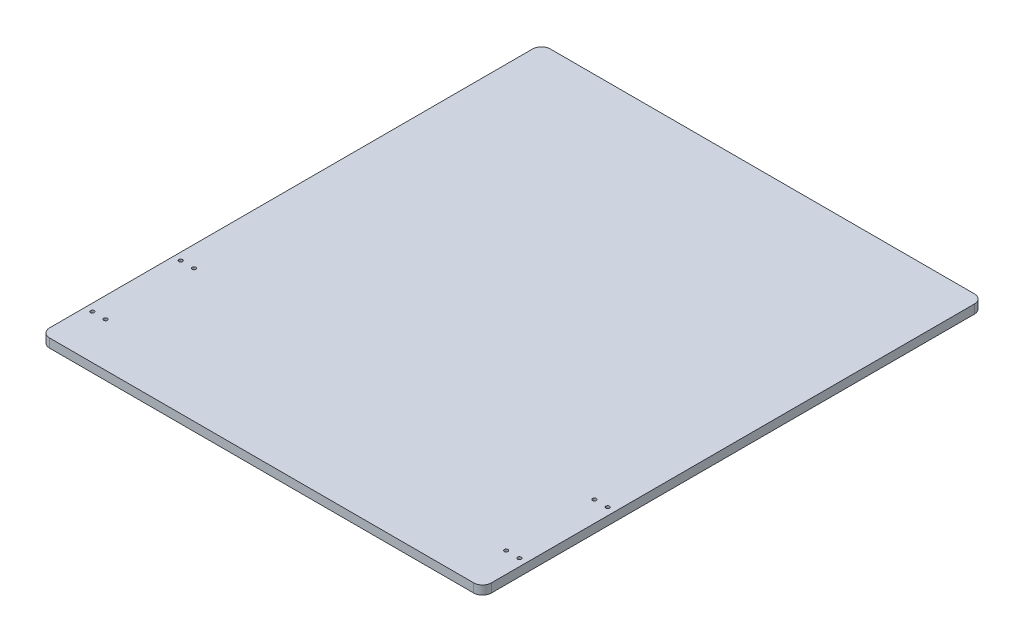
ISO-10303-21;
HEADER;
FILE_DESCRIPTION(('STEP AP214'),'2;1');
FILE_NAME('part.step','',(''),(''),'','','');
FILE_SCHEMA(('AUTOMOTIVE_DESIGN { 1 0 10303 214 1 1 1 1 }'));
ENDSEC;
DATA;
#1=APPLICATION_CONTEXT('core data for automotive mechanical design processes');
#2=APPLICATION_PROTOCOL_DEFINITION('international standard','automotive_design',2000,#1);
#3=PRODUCT_CONTEXT('',#1,'mechanical');
#4=PRODUCT('Part','Part','',(#3));
#5=PRODUCT_RELATED_PRODUCT_CATEGORY('part','',(#4));
#6=PRODUCT_DEFINITION_FORMATION('','',#4);
#7=PRODUCT_DEFINITION_CONTEXT('part definition',#1,'design');
#8=PRODUCT_DEFINITION('design','',#6,#7);
#9=PRODUCT_DEFINITION_SHAPE('','',#8);
#10=(LENGTH_UNIT() NAMED_UNIT(*) SI_UNIT(.MILLI.,.METRE.));
#11=(NAMED_UNIT(*) PLANE_ANGLE_UNIT() SI_UNIT($,.RADIAN.));
#12=(NAMED_UNIT(*) SI_UNIT($,.STERADIAN.) SOLID_ANGLE_UNIT());
#13=UNCERTAINTY_MEASURE_WITH_UNIT(LENGTH_MEASURE(1.E-05),#10,'distance_accuracy_value','');
#14=(GEOMETRIC_REPRESENTATION_CONTEXT(3) GLOBAL_UNCERTAINTY_ASSIGNED_CONTEXT((#13)) GLOBAL_UNIT_ASSIGNED_CONTEXT((#10,
#11,#12)) REPRESENTATION_CONTEXT('',''));
#15=CARTESIAN_POINT('',(0.,0.,0.));
#16=DIRECTION('',(0.,0.,1.));
#17=DIRECTION('',(1.,0.,0.));
#18=AXIS2_PLACEMENT_3D('',#15,#16,#17);
#19=CARTESIAN_POINT('',(150.,6.,-170.));
#20=DIRECTION('',(-1.,0.,0.));
#21=DIRECTION('',(0.,0.,1.));
#22=AXIS2_PLACEMENT_3D('',#19,#20,#21);
#23=PLANE('',#22);
#24=DIRECTION('',(0.,0.,-1.));
#25=VECTOR('',#24,1.);
#26=CARTESIAN_POINT('',(150.,6.,-170.));
#27=LINE('',#26,#25);
#28=CARTESIAN_POINT('',(150.,6.,164.));
#29=VERTEX_POINT('',#28);
#30=CARTESIAN_POINT('',(150.,6.,-164.));
#31=VERTEX_POINT('',#30);
#32=EDGE_CURVE('E123',#29,#31,#27,.T.);
#33=ORIENTED_EDGE('',*,*,#32,.F.);
#34=DIRECTION('',(0.,-1.,0.));
#35=VECTOR('',#34,1.);
#36=CARTESIAN_POINT('',(150.,6.,164.));
#37=LINE('',#36,#35);
#38=CARTESIAN_POINT('',(150.,0.,164.));
#39=VERTEX_POINT('',#38);
#40=EDGE_CURVE('E149',#29,#39,#37,.T.);
#41=ORIENTED_EDGE('',*,*,#40,.T.);
#42=DIRECTION('',(0.,0.,-1.));
#43=VECTOR('',#42,1.);
#44=CARTESIAN_POINT('',(150.,0.,-170.));
#45=LINE('',#44,#43);
#46=CARTESIAN_POINT('',(150.,0.,-164.));
#47=VERTEX_POINT('',#46);
#48=EDGE_CURVE('E157',#39,#47,#45,.T.);
#49=ORIENTED_EDGE('',*,*,#48,.T.);
#50=DIRECTION('',(0.,-1.,0.));
#51=VECTOR('',#50,1.);
#52=CARTESIAN_POINT('',(150.,6.,-164.));
#53=LINE('',#52,#51);
#54=EDGE_CURVE('E147',#47,#31,#53,.F.);
#55=ORIENTED_EDGE('',*,*,#54,.T.);
#56=EDGE_LOOP('',(#33,#41,#49,#55));
#57=FACE_BOUND('',#56,.T.);
#58=ADVANCED_FACE('F32',(#57),#23,.F.);
#59=CARTESIAN_POINT('',(-150.,6.,-170.));
#60=DIRECTION('',(0.,0.,1.));
#61=DIRECTION('',(1.,0.,0.));
#62=AXIS2_PLACEMENT_3D('',#59,#60,#61);
#63=PLANE('',#62);
#64=DIRECTION('',(-1.,0.,0.));
#65=VECTOR('',#64,1.);
#66=CARTESIAN_POINT('',(-150.,0.,-170.));
#67=LINE('',#66,#65);
#68=CARTESIAN_POINT('',(144.,0.,-170.));
#69=VERTEX_POINT('',#68);
#70=CARTESIAN_POINT('',(-144.,0.,-170.));
#71=VERTEX_POINT('',#70);
#72=EDGE_CURVE('E128',#69,#71,#67,.T.);
#73=ORIENTED_EDGE('',*,*,#72,.T.);
#74=DIRECTION('',(0.,-1.,0.));
#75=VECTOR('',#74,1.);
#76=CARTESIAN_POINT('',(-144.,6.,-170.));
#77=LINE('',#76,#75);
#78=CARTESIAN_POINT('',(-144.,6.,-170.));
#79=VERTEX_POINT('',#78);
#80=EDGE_CURVE('E11',#71,#79,#77,.F.);
#81=ORIENTED_EDGE('',*,*,#80,.T.);
#82=DIRECTION('',(-1.,0.,0.));
#83=VECTOR('',#82,1.);
#84=CARTESIAN_POINT('',(-150.,6.,-170.));
#85=LINE('',#84,#83);
#86=CARTESIAN_POINT('',(144.,6.,-170.));
#87=VERTEX_POINT('',#86);
#88=EDGE_CURVE('E126',#87,#79,#85,.T.);
#89=ORIENTED_EDGE('',*,*,#88,.F.);
#90=DIRECTION('',(0.,-1.,0.));
#91=VECTOR('',#90,1.);
#92=CARTESIAN_POINT('',(144.,6.,-170.));
#93=LINE('',#92,#91);
#94=EDGE_CURVE('E40',#87,#69,#93,.T.);
#95=ORIENTED_EDGE('',*,*,#94,.T.);
#96=EDGE_LOOP('',(#73,#81,#89,#95));
#97=FACE_BOUND('',#96,.T.);
#98=ADVANCED_FACE('F154',(#97),#63,.F.);
#99=CARTESIAN_POINT('',(-150.,6.,-170.));
#100=DIRECTION('',(1.,0.,0.));
#101=DIRECTION('',(0.,0.,-1.));
#102=AXIS2_PLACEMENT_3D('',#99,#100,#101);
#103=PLANE('',#102);
#104=DIRECTION('',(0.,0.,1.));
#105=VECTOR('',#104,1.);
#106=CARTESIAN_POINT('',(-150.,0.,-170.));
#107=LINE('',#106,#105);
#108=CARTESIAN_POINT('',(-150.,0.,-164.));
#109=VERTEX_POINT('',#108);
#110=CARTESIAN_POINT('',(-150.,0.,164.));
#111=VERTEX_POINT('',#110);
#112=EDGE_CURVE('E124',#109,#111,#107,.T.);
#113=ORIENTED_EDGE('',*,*,#112,.T.);
#114=DIRECTION('',(0.,-1.,0.));
#115=VECTOR('',#114,1.);
#116=CARTESIAN_POINT('',(-150.,6.,164.));
#117=LINE('',#116,#115);
#118=CARTESIAN_POINT('',(-150.,6.,164.));
#119=VERTEX_POINT('',#118);
#120=EDGE_CURVE('E102',#111,#119,#117,.F.);
#121=ORIENTED_EDGE('',*,*,#120,.T.);
#122=DIRECTION('',(0.,0.,1.));
#123=VECTOR('',#122,1.);
#124=CARTESIAN_POINT('',(-150.,6.,-170.));
#125=LINE('',#124,#123);
#126=CARTESIAN_POINT('',(-150.,6.,-164.));
#127=VERTEX_POINT('',#126);
#128=EDGE_CURVE('E162',#127,#119,#125,.T.);
#129=ORIENTED_EDGE('',*,*,#128,.F.);
#130=DIRECTION('',(0.,-1.,0.));
#131=VECTOR('',#130,1.);
#132=CARTESIAN_POINT('',(-150.,6.,-164.));
#133=LINE('',#132,#131);
#134=EDGE_CURVE('E107',#127,#109,#133,.T.);
#135=ORIENTED_EDGE('',*,*,#134,.T.);
#136=EDGE_LOOP('',(#113,#121,#129,#135));
#137=FACE_BOUND('',#136,.T.);
#138=ADVANCED_FACE('F244',(#137),#103,.F.);
#139=CARTESIAN_POINT('',(-150.,6.,170.));
#140=DIRECTION('',(0.,0.,-1.));
#141=DIRECTION('',(-1.,0.,0.));
#142=AXIS2_PLACEMENT_3D('',#139,#140,#141);
#143=PLANE('',#142);
#144=DIRECTION('',(1.,0.,0.));
#145=VECTOR('',#144,1.);
#146=CARTESIAN_POINT('',(-150.,6.,170.));
#147=LINE('',#146,#145);
#148=CARTESIAN_POINT('',(-144.,6.,170.));
#149=VERTEX_POINT('',#148);
#150=CARTESIAN_POINT('',(144.,6.,170.));
#151=VERTEX_POINT('',#150);
#152=EDGE_CURVE('E117',#149,#151,#147,.T.);
#153=ORIENTED_EDGE('',*,*,#152,.F.);
#154=DIRECTION('',(0.,-1.,0.));
#155=VECTOR('',#154,1.);
#156=CARTESIAN_POINT('',(-144.,6.,170.));
#157=LINE('',#156,#155);
#158=CARTESIAN_POINT('',(-144.,0.,170.));
#159=VERTEX_POINT('',#158);
#160=EDGE_CURVE('E101',#149,#159,#157,.T.);
#161=ORIENTED_EDGE('',*,*,#160,.T.);
#162=DIRECTION('',(1.,0.,0.));
#163=VECTOR('',#162,1.);
#164=CARTESIAN_POINT('',(-150.,0.,170.));
#165=LINE('',#164,#163);
#166=CARTESIAN_POINT('',(144.,0.,170.));
#167=VERTEX_POINT('',#166);
#168=EDGE_CURVE('E114',#159,#167,#165,.T.);
#169=ORIENTED_EDGE('',*,*,#168,.T.);
#170=DIRECTION('',(0.,-1.,0.));
#171=VECTOR('',#170,1.);
#172=CARTESIAN_POINT('',(144.,6.,170.));
#173=LINE('',#172,#171);
#174=EDGE_CURVE('E119',#167,#151,#173,.F.);
#175=ORIENTED_EDGE('',*,*,#174,.T.);
#176=EDGE_LOOP('',(#153,#161,#169,#175));
#177=FACE_BOUND('',#176,.T.);
#178=ADVANCED_FACE('F113',(#177),#143,.F.);
#179=CARTESIAN_POINT('',(0.,6.,0.));
#180=DIRECTION('',(0.,1.,0.));
#181=DIRECTION('',(0.,0.,1.));
#182=AXIS2_PLACEMENT_3D('',#179,#180,#181);
#183=PLANE('',#182);
#184=CARTESIAN_POINT('',(145.,6.,79.9999999999999));
#185=DIRECTION('',(0.,1.,0.));
#186=DIRECTION('',(0.,0.,1.));
#187=AXIS2_PLACEMENT_3D('',#184,#185,#186);
#188=CIRCLE('',#187,1.25000000000001);
#189=CARTESIAN_POINT('',(145.,6.,81.2499999999999));
#190=VERTEX_POINT('',#189);
#191=EDGE_CURVE('E208',#190,#190,#188,.T.);
#192=ORIENTED_EDGE('',*,*,#191,.F.);
#193=EDGE_LOOP('',(#192));
#194=FACE_BOUND('',#193,.T.);
#195=CARTESIAN_POINT('',(145.,6.,140.));
#196=DIRECTION('',(0.,1.,0.));
#197=DIRECTION('',(0.,0.,1.));
#198=AXIS2_PLACEMENT_3D('',#195,#196,#197);
#199=CIRCLE('',#198,1.25000000000001);
#200=CARTESIAN_POINT('',(145.,6.,141.25));
#201=VERTEX_POINT('',#200);
#202=EDGE_CURVE('E202',#201,#201,#199,.T.);
#203=ORIENTED_EDGE('',*,*,#202,.F.);
#204=EDGE_LOOP('',(#203));
#205=FACE_BOUND('',#204,.T.);
#206=CARTESIAN_POINT('',(136.,6.,140.));
#207=DIRECTION('',(0.,1.,0.));
#208=DIRECTION('',(0.,0.,1.));
#209=AXIS2_PLACEMENT_3D('',#206,#207,#208);
#210=CIRCLE('',#209,1.25000000000001);
#211=CARTESIAN_POINT('',(136.,6.,141.25));
#212=VERTEX_POINT('',#211);
#213=EDGE_CURVE('E196',#212,#212,#210,.T.);
#214=ORIENTED_EDGE('',*,*,#213,.F.);
#215=EDGE_LOOP('',(#214));
#216=FACE_BOUND('',#215,.T.);
#217=CARTESIAN_POINT('',(-136.,6.,140.));
#218=DIRECTION('',(0.,1.,0.));
#219=DIRECTION('',(0.,0.,-1.));
#220=AXIS2_PLACEMENT_3D('',#217,#218,#219);
#221=CIRCLE('',#220,1.25000000000001);
#222=CARTESIAN_POINT('',(-136.,6.,138.75));
#223=VERTEX_POINT('',#222);
#224=EDGE_CURVE('E190',#223,#223,#221,.T.);
#225=ORIENTED_EDGE('',*,*,#224,.F.);
#226=EDGE_LOOP('',(#225));
#227=FACE_BOUND('',#226,.T.);
#228=CARTESIAN_POINT('',(-145.,6.,140.));
#229=DIRECTION('',(0.,1.,0.));
#230=DIRECTION('',(0.,0.,-1.));
#231=AXIS2_PLACEMENT_3D('',#228,#229,#230);
#232=CIRCLE('',#231,1.25000000000001);
#233=CARTESIAN_POINT('',(-145.,6.,138.75));
#234=VERTEX_POINT('',#233);
#235=EDGE_CURVE('E184',#234,#234,#232,.T.);
#236=ORIENTED_EDGE('',*,*,#235,.F.);
#237=EDGE_LOOP('',(#236));
#238=FACE_BOUND('',#237,.T.);
#239=CARTESIAN_POINT('',(-145.,6.,79.9999999999999));
#240=DIRECTION('',(0.,1.,0.));
#241=DIRECTION('',(0.,0.,-1.));
#242=AXIS2_PLACEMENT_3D('',#239,#240,#241);
#243=CIRCLE('',#242,1.25000000000001);
#244=CARTESIAN_POINT('',(-145.,6.,78.7499999999999));
#245=VERTEX_POINT('',#244);
#246=EDGE_CURVE('E178',#245,#245,#243,.T.);
#247=ORIENTED_EDGE('',*,*,#246,.F.);
#248=EDGE_LOOP('',(#247));
#249=FACE_BOUND('',#248,.T.);
#250=CARTESIAN_POINT('',(-136.,6.,79.9999999999999));
#251=DIRECTION('',(0.,1.,0.));
#252=DIRECTION('',(0.,0.,-1.));
#253=AXIS2_PLACEMENT_3D('',#250,#251,#252);
#254=CIRCLE('',#253,1.25000000000001);
#255=CARTESIAN_POINT('',(-136.,6.,78.7499999999999));
#256=VERTEX_POINT('',#255);
#257=EDGE_CURVE('E172',#256,#256,#254,.T.);
#258=ORIENTED_EDGE('',*,*,#257,.F.);
#259=EDGE_LOOP('',(#258));
#260=FACE_BOUND('',#259,.T.);
#261=CARTESIAN_POINT('',(136.,6.,79.9999999999999));
#262=DIRECTION('',(0.,1.,0.));
#263=DIRECTION('',(0.,0.,1.));
#264=AXIS2_PLACEMENT_3D('',#261,#262,#263);
#265=CIRCLE('',#264,1.25000000000001);
#266=CARTESIAN_POINT('',(136.,6.,81.2499999999999));
#267=VERTEX_POINT('',#266);
#268=EDGE_CURVE('E166',#267,#267,#265,.T.);
#269=ORIENTED_EDGE('',*,*,#268,.F.);
#270=EDGE_LOOP('',(#269));
#271=FACE_BOUND('',#270,.T.);
#272=ORIENTED_EDGE('',*,*,#128,.T.);
#273=CARTESIAN_POINT('',(-144.,6.,164.));
#274=DIRECTION('',(0.,1.,0.));
#275=DIRECTION('',(0.,0.,1.));
#276=AXIS2_PLACEMENT_3D('',#273,#274,#275);
#277=CIRCLE('',#276,6.);
#278=EDGE_CURVE('E145',#119,#149,#277,.T.);
#279=ORIENTED_EDGE('',*,*,#278,.T.);
#280=ORIENTED_EDGE('',*,*,#152,.T.);
#281=CARTESIAN_POINT('',(144.,6.,164.));
#282=DIRECTION('',(0.,1.,0.));
#283=DIRECTION('',(0.,0.,1.));
#284=AXIS2_PLACEMENT_3D('',#281,#282,#283);
#285=CIRCLE('',#284,6.);
#286=EDGE_CURVE('E143',#151,#29,#285,.T.);
#287=ORIENTED_EDGE('',*,*,#286,.T.);
#288=ORIENTED_EDGE('',*,*,#32,.T.);
#289=CARTESIAN_POINT('',(144.,6.,-164.));
#290=DIRECTION('',(0.,1.,0.));
#291=DIRECTION('',(0.,0.,1.));
#292=AXIS2_PLACEMENT_3D('',#289,#290,#291);
#293=CIRCLE('',#292,6.);
#294=EDGE_CURVE('E52',#31,#87,#293,.T.);
#295=ORIENTED_EDGE('',*,*,#294,.T.);
#296=ORIENTED_EDGE('',*,*,#88,.T.);
#297=CARTESIAN_POINT('',(-144.,6.,-164.));
#298=DIRECTION('',(0.,1.,0.));
#299=DIRECTION('',(0.,0.,1.));
#300=AXIS2_PLACEMENT_3D('',#297,#298,#299);
#301=CIRCLE('',#300,6.);
#302=EDGE_CURVE('E141',#79,#127,#301,.T.);
#303=ORIENTED_EDGE('',*,*,#302,.T.);
#304=EDGE_LOOP('',(#272,#279,#280,#287,#288,#295,#296,#303));
#305=FACE_BOUND('',#304,.T.);
#306=ADVANCED_FACE('F223',(#194,#205,#216,#227,#238,#249,#260,#271,#305),#183,.T.);
#307=CARTESIAN_POINT('',(0.,0.,0.));
#308=DIRECTION('',(0.,1.,0.));
#309=DIRECTION('',(0.,0.,1.));
#310=AXIS2_PLACEMENT_3D('',#307,#308,#309);
#311=PLANE('',#310);
#312=CARTESIAN_POINT('',(145.,0.,79.9999999999999));
#313=DIRECTION('',(0.,1.,0.));
#314=DIRECTION('',(0.,0.,1.));
#315=AXIS2_PLACEMENT_3D('',#312,#313,#314);
#316=CIRCLE('',#315,1.25000000000001);
#317=CARTESIAN_POINT('',(145.,0.,81.2499999999999));
#318=VERTEX_POINT('',#317);
#319=EDGE_CURVE('E169',#318,#318,#316,.T.);
#320=ORIENTED_EDGE('',*,*,#319,.T.);
#321=EDGE_LOOP('',(#320));
#322=FACE_BOUND('',#321,.T.);
#323=CARTESIAN_POINT('',(145.,0.,140.));
#324=DIRECTION('',(0.,1.,0.));
#325=DIRECTION('',(0.,0.,1.));
#326=AXIS2_PLACEMENT_3D('',#323,#324,#325);
#327=CIRCLE('',#326,1.25000000000001);
#328=CARTESIAN_POINT('',(145.,0.,141.25));
#329=VERTEX_POINT('',#328);
#330=EDGE_CURVE('E205',#329,#329,#327,.T.);
#331=ORIENTED_EDGE('',*,*,#330,.T.);
#332=EDGE_LOOP('',(#331));
#333=FACE_BOUND('',#332,.T.);
#334=CARTESIAN_POINT('',(136.,0.,140.));
#335=DIRECTION('',(0.,1.,0.));
#336=DIRECTION('',(0.,0.,1.));
#337=AXIS2_PLACEMENT_3D('',#334,#335,#336);
#338=CIRCLE('',#337,1.25000000000001);
#339=CARTESIAN_POINT('',(136.,0.,141.25));
#340=VERTEX_POINT('',#339);
#341=EDGE_CURVE('E199',#340,#340,#338,.T.);
#342=ORIENTED_EDGE('',*,*,#341,.T.);
#343=EDGE_LOOP('',(#342));
#344=FACE_BOUND('',#343,.T.);
#345=CARTESIAN_POINT('',(-136.,0.,140.));
#346=DIRECTION('',(0.,1.,0.));
#347=DIRECTION('',(0.,0.,-1.));
#348=AXIS2_PLACEMENT_3D('',#345,#346,#347);
#349=CIRCLE('',#348,1.25000000000001);
#350=CARTESIAN_POINT('',(-136.,0.,138.75));
#351=VERTEX_POINT('',#350);
#352=EDGE_CURVE('E193',#351,#351,#349,.T.);
#353=ORIENTED_EDGE('',*,*,#352,.T.);
#354=EDGE_LOOP('',(#353));
#355=FACE_BOUND('',#354,.T.);
#356=CARTESIAN_POINT('',(-145.,0.,140.));
#357=DIRECTION('',(0.,1.,0.));
#358=DIRECTION('',(0.,0.,-1.));
#359=AXIS2_PLACEMENT_3D('',#356,#357,#358);
#360=CIRCLE('',#359,1.25000000000001);
#361=CARTESIAN_POINT('',(-145.,0.,138.75));
#362=VERTEX_POINT('',#361);
#363=EDGE_CURVE('E187',#362,#362,#360,.T.);
#364=ORIENTED_EDGE('',*,*,#363,.T.);
#365=EDGE_LOOP('',(#364));
#366=FACE_BOUND('',#365,.T.);
#367=CARTESIAN_POINT('',(-145.,0.,79.9999999999999));
#368=DIRECTION('',(0.,1.,0.));
#369=DIRECTION('',(0.,0.,-1.));
#370=AXIS2_PLACEMENT_3D('',#367,#368,#369);
#371=CIRCLE('',#370,1.25000000000001);
#372=CARTESIAN_POINT('',(-145.,0.,78.7499999999999));
#373=VERTEX_POINT('',#372);
#374=EDGE_CURVE('E181',#373,#373,#371,.T.);
#375=ORIENTED_EDGE('',*,*,#374,.T.);
#376=EDGE_LOOP('',(#375));
#377=FACE_BOUND('',#376,.T.);
#378=CARTESIAN_POINT('',(-136.,0.,79.9999999999999));
#379=DIRECTION('',(0.,1.,0.));
#380=DIRECTION('',(0.,0.,-1.));
#381=AXIS2_PLACEMENT_3D('',#378,#379,#380);
#382=CIRCLE('',#381,1.25000000000001);
#383=CARTESIAN_POINT('',(-136.,0.,78.7499999999999));
#384=VERTEX_POINT('',#383);
#385=EDGE_CURVE('E175',#384,#384,#382,.T.);
#386=ORIENTED_EDGE('',*,*,#385,.T.);
#387=EDGE_LOOP('',(#386));
#388=FACE_BOUND('',#387,.T.);
#389=CARTESIAN_POINT('',(136.,0.,79.9999999999999));
#390=DIRECTION('',(0.,1.,0.));
#391=DIRECTION('',(0.,0.,1.));
#392=AXIS2_PLACEMENT_3D('',#389,#390,#391);
#393=CIRCLE('',#392,1.25000000000001);
#394=CARTESIAN_POINT('',(136.,0.,81.2499999999999));
#395=VERTEX_POINT('',#394);
#396=EDGE_CURVE('E158',#395,#395,#393,.T.);
#397=ORIENTED_EDGE('',*,*,#396,.T.);
#398=EDGE_LOOP('',(#397));
#399=FACE_BOUND('',#398,.T.);
#400=ORIENTED_EDGE('',*,*,#168,.F.);
#401=CARTESIAN_POINT('',(-144.,0.,164.));
#402=DIRECTION('',(0.,1.,0.));
#403=DIRECTION('',(0.,0.,1.));
#404=AXIS2_PLACEMENT_3D('',#401,#402,#403);
#405=CIRCLE('',#404,6.);
#406=EDGE_CURVE('E97',#159,#111,#405,.F.);
#407=ORIENTED_EDGE('',*,*,#406,.T.);
#408=ORIENTED_EDGE('',*,*,#112,.F.);
#409=CARTESIAN_POINT('',(-144.,0.,-164.));
#410=DIRECTION('',(0.,1.,0.));
#411=DIRECTION('',(0.,0.,1.));
#412=AXIS2_PLACEMENT_3D('',#409,#410,#411);
#413=CIRCLE('',#412,6.);
#414=EDGE_CURVE('E134',#109,#71,#413,.F.);
#415=ORIENTED_EDGE('',*,*,#414,.T.);
#416=ORIENTED_EDGE('',*,*,#72,.F.);
#417=CARTESIAN_POINT('',(144.,0.,-164.));
#418=DIRECTION('',(0.,1.,0.));
#419=DIRECTION('',(0.,0.,1.));
#420=AXIS2_PLACEMENT_3D('',#417,#418,#419);
#421=CIRCLE('',#420,6.);
#422=EDGE_CURVE('E118',#69,#47,#421,.F.);
#423=ORIENTED_EDGE('',*,*,#422,.T.);
#424=ORIENTED_EDGE('',*,*,#48,.F.);
#425=CARTESIAN_POINT('',(144.,0.,164.));
#426=DIRECTION('',(0.,1.,0.));
#427=DIRECTION('',(0.,0.,1.));
#428=AXIS2_PLACEMENT_3D('',#425,#426,#427);
#429=CIRCLE('',#428,6.);
#430=EDGE_CURVE('E108',#39,#167,#429,.F.);
#431=ORIENTED_EDGE('',*,*,#430,.T.);
#432=EDGE_LOOP('',(#400,#407,#408,#415,#416,#423,#424,#431));
#433=FACE_BOUND('',#432,.T.);
#434=ADVANCED_FACE('F121',(#322,#333,#344,#355,#366,#377,#388,#399,#433),#311,.F.);
#435=CARTESIAN_POINT('',(-144.,6.,164.));
#436=DIRECTION('',(0.,-1.,0.));
#437=DIRECTION('',(0.,0.,-1.));
#438=AXIS2_PLACEMENT_3D('',#435,#436,#437);
#439=CYLINDRICAL_SURFACE('',#438,6.);
#440=ORIENTED_EDGE('',*,*,#278,.F.);
#441=ORIENTED_EDGE('',*,*,#120,.F.);
#442=ORIENTED_EDGE('',*,*,#406,.F.);
#443=ORIENTED_EDGE('',*,*,#160,.F.);
#444=EDGE_LOOP('',(#440,#441,#442,#443));
#445=FACE_BOUND('',#444,.T.);
#446=ADVANCED_FACE('F100',(#445),#439,.T.);
#447=CARTESIAN_POINT('',(144.,6.,164.));
#448=DIRECTION('',(0.,-1.,0.));
#449=DIRECTION('',(0.,0.,-1.));
#450=AXIS2_PLACEMENT_3D('',#447,#448,#449);
#451=CYLINDRICAL_SURFACE('',#450,6.);
#452=ORIENTED_EDGE('',*,*,#286,.F.);
#453=ORIENTED_EDGE('',*,*,#174,.F.);
#454=ORIENTED_EDGE('',*,*,#430,.F.);
#455=ORIENTED_EDGE('',*,*,#40,.F.);
#456=EDGE_LOOP('',(#452,#453,#454,#455));
#457=FACE_BOUND('',#456,.T.);
#458=ADVANCED_FACE('F248',(#457),#451,.T.);
#459=CARTESIAN_POINT('',(-144.,6.,-164.));
#460=DIRECTION('',(0.,-1.,0.));
#461=DIRECTION('',(0.,0.,-1.));
#462=AXIS2_PLACEMENT_3D('',#459,#460,#461);
#463=CYLINDRICAL_SURFACE('',#462,6.);
#464=ORIENTED_EDGE('',*,*,#302,.F.);
#465=ORIENTED_EDGE('',*,*,#80,.F.);
#466=ORIENTED_EDGE('',*,*,#414,.F.);
#467=ORIENTED_EDGE('',*,*,#134,.F.);
#468=EDGE_LOOP('',(#464,#465,#466,#467));
#469=FACE_BOUND('',#468,.T.);
#470=ADVANCED_FACE('F246',(#469),#463,.T.);
#471=CARTESIAN_POINT('',(144.,6.,-164.));
#472=DIRECTION('',(0.,-1.,0.));
#473=DIRECTION('',(0.,0.,-1.));
#474=AXIS2_PLACEMENT_3D('',#471,#472,#473);
#475=CYLINDRICAL_SURFACE('',#474,6.);
#476=ORIENTED_EDGE('',*,*,#294,.F.);
#477=ORIENTED_EDGE('',*,*,#54,.F.);
#478=ORIENTED_EDGE('',*,*,#422,.F.);
#479=ORIENTED_EDGE('',*,*,#94,.F.);
#480=EDGE_LOOP('',(#476,#477,#478,#479));
#481=FACE_BOUND('',#480,.T.);
#482=ADVANCED_FACE('F34',(#481),#475,.T.);
#483=CARTESIAN_POINT('',(136.,0.,79.9999999999999));
#484=DIRECTION('',(0.,1.,0.));
#485=DIRECTION('',(0.,0.,1.));
#486=AXIS2_PLACEMENT_3D('',#483,#484,#485);
#487=CYLINDRICAL_SURFACE('',#486,1.25000000000001);
#488=ORIENTED_EDGE('',*,*,#396,.F.);
#489=EDGE_LOOP('',(#488));
#490=FACE_BOUND('',#489,.T.);
#491=ORIENTED_EDGE('',*,*,#268,.T.);
#492=EDGE_LOOP('',(#491));
#493=FACE_BOUND('',#492,.T.);
#494=ADVANCED_FACE('F253',(#490,#493),#487,.F.);
#495=CARTESIAN_POINT('',(-136.,0.,79.9999999999999));
#496=DIRECTION('',(0.,1.,0.));
#497=DIRECTION('',(0.,0.,1.));
#498=AXIS2_PLACEMENT_3D('',#495,#496,#497);
#499=CYLINDRICAL_SURFACE('',#498,1.25000000000001);
#500=ORIENTED_EDGE('',*,*,#385,.F.);
#501=EDGE_LOOP('',(#500));
#502=FACE_BOUND('',#501,.T.);
#503=ORIENTED_EDGE('',*,*,#257,.T.);
#504=EDGE_LOOP('',(#503));
#505=FACE_BOUND('',#504,.T.);
#506=ADVANCED_FACE('F321',(#502,#505),#499,.F.);
#507=CARTESIAN_POINT('',(-145.,0.,79.9999999999999));
#508=DIRECTION('',(0.,1.,0.));
#509=DIRECTION('',(0.,0.,1.));
#510=AXIS2_PLACEMENT_3D('',#507,#508,#509);
#511=CYLINDRICAL_SURFACE('',#510,1.25000000000001);
#512=ORIENTED_EDGE('',*,*,#374,.F.);
#513=EDGE_LOOP('',(#512));
#514=FACE_BOUND('',#513,.T.);
#515=ORIENTED_EDGE('',*,*,#246,.T.);
#516=EDGE_LOOP('',(#515));
#517=FACE_BOUND('',#516,.T.);
#518=ADVANCED_FACE('F329',(#514,#517),#511,.F.);
#519=CARTESIAN_POINT('',(-145.,0.,140.));
#520=DIRECTION('',(0.,1.,0.));
#521=DIRECTION('',(0.,0.,1.));
#522=AXIS2_PLACEMENT_3D('',#519,#520,#521);
#523=CYLINDRICAL_SURFACE('',#522,1.25000000000001);
#524=ORIENTED_EDGE('',*,*,#363,.F.);
#525=EDGE_LOOP('',(#524));
#526=FACE_BOUND('',#525,.T.);
#527=ORIENTED_EDGE('',*,*,#235,.T.);
#528=EDGE_LOOP('',(#527));
#529=FACE_BOUND('',#528,.T.);
#530=ADVANCED_FACE('F338',(#526,#529),#523,.F.);
#531=CARTESIAN_POINT('',(-136.,0.,140.));
#532=DIRECTION('',(0.,1.,0.));
#533=DIRECTION('',(0.,0.,1.));
#534=AXIS2_PLACEMENT_3D('',#531,#532,#533);
#535=CYLINDRICAL_SURFACE('',#534,1.25000000000001);
#536=ORIENTED_EDGE('',*,*,#352,.F.);
#537=EDGE_LOOP('',(#536));
#538=FACE_BOUND('',#537,.T.);
#539=ORIENTED_EDGE('',*,*,#224,.T.);
#540=EDGE_LOOP('',(#539));
#541=FACE_BOUND('',#540,.T.);
#542=ADVANCED_FACE('F347',(#538,#541),#535,.F.);
#543=CARTESIAN_POINT('',(136.,0.,140.));
#544=DIRECTION('',(0.,1.,0.));
#545=DIRECTION('',(0.,0.,1.));
#546=AXIS2_PLACEMENT_3D('',#543,#544,#545);
#547=CYLINDRICAL_SURFACE('',#546,1.25000000000001);
#548=ORIENTED_EDGE('',*,*,#341,.F.);
#549=EDGE_LOOP('',(#548));
#550=FACE_BOUND('',#549,.T.);
#551=ORIENTED_EDGE('',*,*,#213,.T.);
#552=EDGE_LOOP('',(#551));
#553=FACE_BOUND('',#552,.T.);
#554=ADVANCED_FACE('F356',(#550,#553),#547,.F.);
#555=CARTESIAN_POINT('',(145.,0.,140.));
#556=DIRECTION('',(0.,1.,0.));
#557=DIRECTION('',(0.,0.,1.));
#558=AXIS2_PLACEMENT_3D('',#555,#556,#557);
#559=CYLINDRICAL_SURFACE('',#558,1.25000000000001);
#560=ORIENTED_EDGE('',*,*,#330,.F.);
#561=EDGE_LOOP('',(#560));
#562=FACE_BOUND('',#561,.T.);
#563=ORIENTED_EDGE('',*,*,#202,.T.);
#564=EDGE_LOOP('',(#563));
#565=FACE_BOUND('',#564,.T.);
#566=ADVANCED_FACE('F219',(#562,#565),#559,.F.);
#567=CARTESIAN_POINT('',(145.,0.,79.9999999999999));
#568=DIRECTION('',(0.,1.,0.));
#569=DIRECTION('',(0.,0.,1.));
#570=AXIS2_PLACEMENT_3D('',#567,#568,#569);
#571=CYLINDRICAL_SURFACE('',#570,1.25000000000001);
#572=ORIENTED_EDGE('',*,*,#319,.F.);
#573=EDGE_LOOP('',(#572));
#574=FACE_BOUND('',#573,.T.);
#575=ORIENTED_EDGE('',*,*,#191,.T.);
#576=EDGE_LOOP('',(#575));
#577=FACE_BOUND('',#576,.T.);
#578=ADVANCED_FACE('F216',(#574,#577),#571,.F.);
#579=CLOSED_SHELL('',(#58,#98,#138,#178,#306,#434,#446,#458,#470,#482,#494,#506,#518,#530,#542,
#554,#566,#578));
#580=MANIFOLD_SOLID_BREP('B2',#579);
#581=ADVANCED_BREP_SHAPE_REPRESENTATION('',(#18,#580),#14);
#582=SHAPE_DEFINITION_REPRESENTATION(#9,#581);
ENDSEC;
END-ISO-10303-21;
